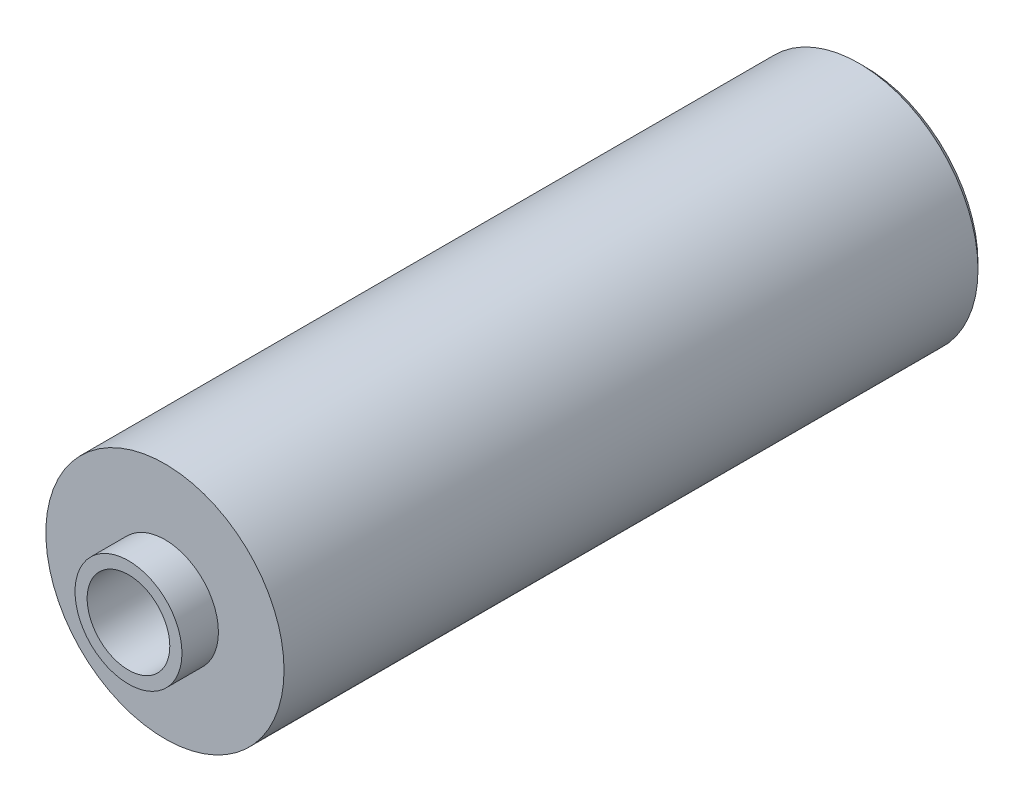
ISO-10303-21;
HEADER;
FILE_DESCRIPTION(('STEP AP214'),'2;1');
FILE_NAME('part.step','',(''),(''),'','','');
FILE_SCHEMA(('AUTOMOTIVE_DESIGN { 1 0 10303 214 1 1 1 1 }'));
ENDSEC;
DATA;
#1=APPLICATION_CONTEXT('core data for automotive mechanical design processes');
#2=APPLICATION_PROTOCOL_DEFINITION('international standard','automotive_design',2000,#1);
#3=PRODUCT_CONTEXT('',#1,'mechanical');
#4=PRODUCT('Part','Part','',(#3));
#5=PRODUCT_RELATED_PRODUCT_CATEGORY('part','',(#4));
#6=PRODUCT_DEFINITION_FORMATION('','',#4);
#7=PRODUCT_DEFINITION_CONTEXT('part definition',#1,'design');
#8=PRODUCT_DEFINITION('design','',#6,#7);
#9=PRODUCT_DEFINITION_SHAPE('','',#8);
#10=(LENGTH_UNIT() NAMED_UNIT(*) SI_UNIT(.MILLI.,.METRE.));
#11=(NAMED_UNIT(*) PLANE_ANGLE_UNIT() SI_UNIT($,.RADIAN.));
#12=(NAMED_UNIT(*) SI_UNIT($,.STERADIAN.) SOLID_ANGLE_UNIT());
#13=UNCERTAINTY_MEASURE_WITH_UNIT(LENGTH_MEASURE(1.E-05),#10,'distance_accuracy_value','');
#14=(GEOMETRIC_REPRESENTATION_CONTEXT(3) GLOBAL_UNCERTAINTY_ASSIGNED_CONTEXT((#13)) GLOBAL_UNIT_ASSIGNED_CONTEXT((#10,
#11,#12)) REPRESENTATION_CONTEXT('',''));
#15=CARTESIAN_POINT('',(0.,0.,0.));
#16=DIRECTION('',(0.,0.,1.));
#17=DIRECTION('',(1.,0.,0.));
#18=AXIS2_PLACEMENT_3D('',#15,#16,#17);
#19=CARTESIAN_POINT('',(0.,0.,28.8));
#20=DIRECTION('',(0.,0.,1.));
#21=DIRECTION('',(1.,0.,0.));
#22=AXIS2_PLACEMENT_3D('',#19,#20,#21);
#23=PLANE('',#22);
#24=CARTESIAN_POINT('',(0.,0.,28.8));
#25=DIRECTION('',(0.,0.,1.));
#26=DIRECTION('',(1.,0.,0.));
#27=AXIS2_PLACEMENT_3D('',#24,#25,#26);
#28=CIRCLE('',#27,4.9);
#29=CARTESIAN_POINT('',(4.9,0.,28.8));
#30=VERTEX_POINT('',#29);
#31=EDGE_CURVE('E64',#30,#30,#28,.T.);
#32=ORIENTED_EDGE('',*,*,#31,.T.);
#33=EDGE_LOOP('',(#32));
#34=FACE_BOUND('',#33,.T.);
#35=CARTESIAN_POINT('',(0.,0.,28.8));
#36=DIRECTION('',(0.,0.,1.));
#37=DIRECTION('',(1.,0.,0.));
#38=AXIS2_PLACEMENT_3D('',#35,#36,#37);
#39=CIRCLE('',#38,2.2);
#40=CARTESIAN_POINT('',(2.2,0.,28.8));
#41=VERTEX_POINT('',#40);
#42=EDGE_CURVE('E69',#41,#41,#39,.T.);
#43=ORIENTED_EDGE('',*,*,#42,.F.);
#44=EDGE_LOOP('',(#43));
#45=FACE_BOUND('',#44,.T.);
#46=ADVANCED_FACE('F39',(#34,#45),#23,.T.);
#47=CARTESIAN_POINT('',(0.,0.,0.));
#48=DIRECTION('',(0.,0.,1.));
#49=DIRECTION('',(1.,0.,0.));
#50=AXIS2_PLACEMENT_3D('',#47,#48,#49);
#51=PLANE('',#50);
#52=CARTESIAN_POINT('',(0.,0.,0.));
#53=DIRECTION('',(0.,0.,1.));
#54=DIRECTION('',(1.,0.,0.));
#55=AXIS2_PLACEMENT_3D('',#52,#53,#54);
#56=CIRCLE('',#55,1.94999999999999);
#57=CARTESIAN_POINT('',(1.94999999999999,0.,0.));
#58=VERTEX_POINT('',#57);
#59=EDGE_CURVE('E53',#58,#58,#56,.T.);
#60=ORIENTED_EDGE('',*,*,#59,.T.);
#61=EDGE_LOOP('',(#60));
#62=FACE_BOUND('',#61,.T.);
#63=CARTESIAN_POINT('',(0.,0.,0.));
#64=DIRECTION('',(0.,0.,1.));
#65=DIRECTION('',(1.,0.,0.));
#66=AXIS2_PLACEMENT_3D('',#63,#64,#65);
#67=CIRCLE('',#66,4.65);
#68=CARTESIAN_POINT('',(4.65,0.,0.));
#69=VERTEX_POINT('',#68);
#70=EDGE_CURVE('E58',#69,#69,#67,.F.);
#71=ORIENTED_EDGE('',*,*,#70,.T.);
#72=EDGE_LOOP('',(#71));
#73=FACE_BOUND('',#72,.T.);
#74=ADVANCED_FACE('F98',(#62,#73),#51,.F.);
#75=CARTESIAN_POINT('',(0.,0.,28.8));
#76=DIRECTION('',(0.,0.,-1.));
#77=DIRECTION('',(-1.,0.,0.));
#78=AXIS2_PLACEMENT_3D('',#75,#76,#77);
#79=CYLINDRICAL_SURFACE('',#78,4.9);
#80=CARTESIAN_POINT('',(0.,0.,0.249999999999997));
#81=DIRECTION('',(0.,0.,1.));
#82=DIRECTION('',(1.,0.,0.));
#83=AXIS2_PLACEMENT_3D('',#80,#81,#82);
#84=CIRCLE('',#83,4.9);
#85=CARTESIAN_POINT('',(4.9,0.,0.249999999999997));
#86=VERTEX_POINT('',#85);
#87=EDGE_CURVE('E10',#86,#86,#84,.T.);
#88=ORIENTED_EDGE('',*,*,#87,.T.);
#89=EDGE_LOOP('',(#88));
#90=FACE_BOUND('',#89,.T.);
#91=ORIENTED_EDGE('',*,*,#31,.F.);
#92=EDGE_LOOP('',(#91));
#93=FACE_BOUND('',#92,.T.);
#94=ADVANCED_FACE('F95',(#90,#93),#79,.T.);
#95=CARTESIAN_POINT('',(0.,0.,28.8));
#96=DIRECTION('',(0.,0.,-1.));
#97=DIRECTION('',(-1.,0.,0.));
#98=AXIS2_PLACEMENT_3D('',#95,#96,#97);
#99=CYLINDRICAL_SURFACE('',#98,1.7);
#100=CARTESIAN_POINT('',(0.,0.,0.249999999999997));
#101=DIRECTION('',(0.,0.,1.));
#102=DIRECTION('',(1.,0.,0.));
#103=AXIS2_PLACEMENT_3D('',#100,#101,#102);
#104=CIRCLE('',#103,1.7);
#105=CARTESIAN_POINT('',(1.7,0.,0.249999999999997));
#106=VERTEX_POINT('',#105);
#107=EDGE_CURVE('E48',#106,#106,#104,.F.);
#108=ORIENTED_EDGE('',*,*,#107,.T.);
#109=EDGE_LOOP('',(#108));
#110=FACE_BOUND('',#109,.T.);
#111=CARTESIAN_POINT('',(0.,0.,30.3));
#112=DIRECTION('',(0.,0.,1.));
#113=DIRECTION('',(1.,0.,0.));
#114=AXIS2_PLACEMENT_3D('',#111,#112,#113);
#115=CIRCLE('',#114,1.7);
#116=CARTESIAN_POINT('',(1.7,0.,30.3));
#117=VERTEX_POINT('',#116);
#118=EDGE_CURVE('E73',#117,#117,#115,.T.);
#119=ORIENTED_EDGE('',*,*,#118,.T.);
#120=EDGE_LOOP('',(#119));
#121=FACE_BOUND('',#120,.T.);
#122=ADVANCED_FACE('F81',(#110,#121),#99,.F.);
#123=CARTESIAN_POINT('',(0.,0.,30.3));
#124=DIRECTION('',(0.,0.,1.));
#125=DIRECTION('',(1.,0.,0.));
#126=AXIS2_PLACEMENT_3D('',#123,#124,#125);
#127=PLANE('',#126);
#128=CARTESIAN_POINT('',(0.,0.,30.3));
#129=DIRECTION('',(0.,0.,1.));
#130=DIRECTION('',(1.,0.,0.));
#131=AXIS2_PLACEMENT_3D('',#128,#129,#130);
#132=CIRCLE('',#131,2.2);
#133=CARTESIAN_POINT('',(2.2,0.,30.3));
#134=VERTEX_POINT('',#133);
#135=EDGE_CURVE('E68',#134,#134,#132,.T.);
#136=ORIENTED_EDGE('',*,*,#135,.T.);
#137=EDGE_LOOP('',(#136));
#138=FACE_BOUND('',#137,.T.);
#139=ORIENTED_EDGE('',*,*,#118,.F.);
#140=EDGE_LOOP('',(#139));
#141=FACE_BOUND('',#140,.T.);
#142=ADVANCED_FACE('F83',(#138,#141),#127,.T.);
#143=CARTESIAN_POINT('',(0.,0.,30.3));
#144=DIRECTION('',(0.,0.,-1.));
#145=DIRECTION('',(-1.,0.,0.));
#146=AXIS2_PLACEMENT_3D('',#143,#144,#145);
#147=CYLINDRICAL_SURFACE('',#146,2.2);
#148=ORIENTED_EDGE('',*,*,#135,.F.);
#149=EDGE_LOOP('',(#148));
#150=FACE_BOUND('',#149,.T.);
#151=ORIENTED_EDGE('',*,*,#42,.T.);
#152=EDGE_LOOP('',(#151));
#153=FACE_BOUND('',#152,.T.);
#154=ADVANCED_FACE('F85',(#150,#153),#147,.T.);
#155=CARTESIAN_POINT('',(0.,0.,0.));
#156=DIRECTION('',(0.,0.,-1.));
#157=DIRECTION('',(-1.,0.,0.));
#158=AXIS2_PLACEMENT_3D('',#155,#156,#157);
#159=CONICAL_SURFACE('',#158,1.94999999999999,0.785398163397442);
#160=ORIENTED_EDGE('',*,*,#107,.F.);
#161=EDGE_LOOP('',(#160));
#162=FACE_BOUND('',#161,.T.);
#163=ORIENTED_EDGE('',*,*,#59,.F.);
#164=EDGE_LOOP('',(#163));
#165=FACE_BOUND('',#164,.T.);
#166=ADVANCED_FACE('F92',(#162,#165),#159,.F.);
#167=CARTESIAN_POINT('',(0.,0.,0.249999999999997));
#168=DIRECTION('',(0.,0.,1.));
#169=DIRECTION('',(1.,0.,0.));
#170=AXIS2_PLACEMENT_3D('',#167,#168,#169);
#171=CONICAL_SURFACE('',#170,4.9,0.785398163397455);
#172=ORIENTED_EDGE('',*,*,#70,.F.);
#173=EDGE_LOOP('',(#172));
#174=FACE_BOUND('',#173,.T.);
#175=ORIENTED_EDGE('',*,*,#87,.F.);
#176=EDGE_LOOP('',(#175));
#177=FACE_BOUND('',#176,.T.);
#178=ADVANCED_FACE('F42',(#174,#177),#171,.T.);
#179=CLOSED_SHELL('',(#46,#74,#94,#122,#142,#154,#166,#178));
#180=MANIFOLD_SOLID_BREP('B2',#179);
#181=ADVANCED_BREP_SHAPE_REPRESENTATION('',(#18,#180),#14);
#182=SHAPE_DEFINITION_REPRESENTATION(#9,#181);
ENDSEC;
END-ISO-10303-21;
